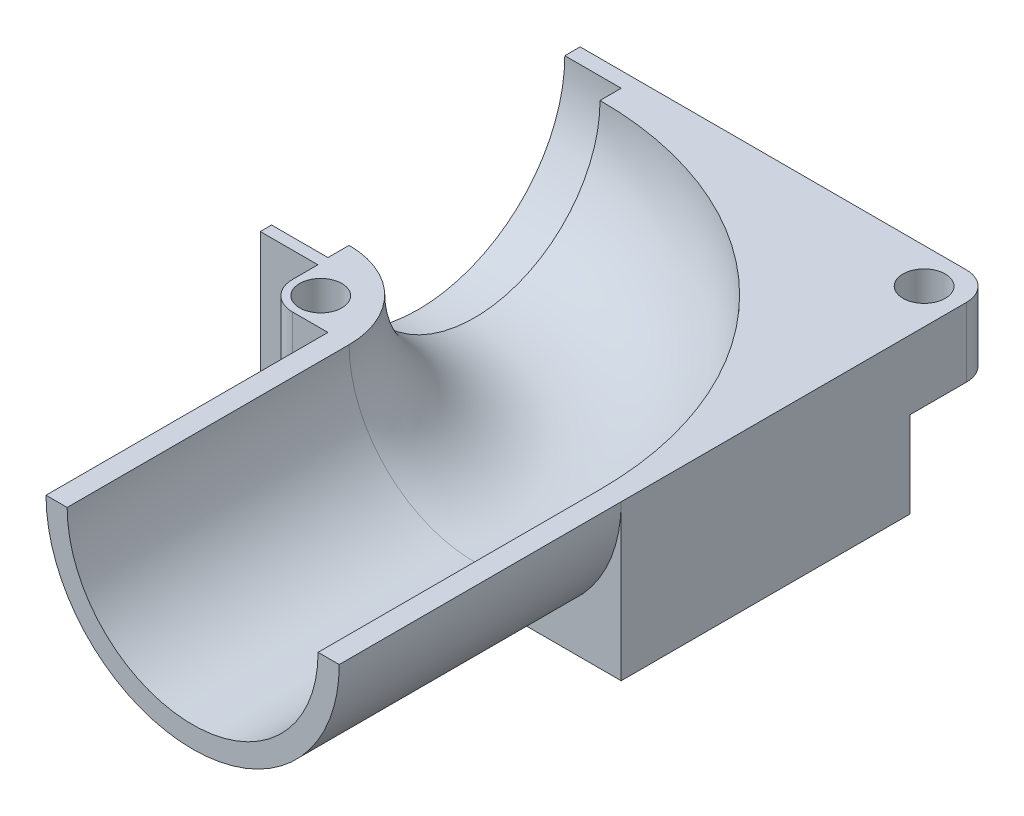
ISO-10303-21;
HEADER;
FILE_DESCRIPTION(('STEP AP214'),'2;1');
FILE_NAME('part.step','',(''),(''),'','','');
FILE_SCHEMA(('AUTOMOTIVE_DESIGN { 1 0 10303 214 1 1 1 1 }'));
ENDSEC;
DATA;
#1=APPLICATION_CONTEXT('core data for automotive mechanical design processes');
#2=APPLICATION_PROTOCOL_DEFINITION('international standard','automotive_design',2000,#1);
#3=PRODUCT_CONTEXT('',#1,'mechanical');
#4=PRODUCT('Part','Part','',(#3));
#5=PRODUCT_RELATED_PRODUCT_CATEGORY('part','',(#4));
#6=PRODUCT_DEFINITION_FORMATION('','',#4);
#7=PRODUCT_DEFINITION_CONTEXT('part definition',#1,'design');
#8=PRODUCT_DEFINITION('design','',#6,#7);
#9=PRODUCT_DEFINITION_SHAPE('','',#8);
#10=(LENGTH_UNIT() NAMED_UNIT(*) SI_UNIT(.MILLI.,.METRE.));
#11=(NAMED_UNIT(*) PLANE_ANGLE_UNIT() SI_UNIT($,.RADIAN.));
#12=(NAMED_UNIT(*) SI_UNIT($,.STERADIAN.) SOLID_ANGLE_UNIT());
#13=UNCERTAINTY_MEASURE_WITH_UNIT(LENGTH_MEASURE(1.E-05),#10,'distance_accuracy_value','');
#14=(GEOMETRIC_REPRESENTATION_CONTEXT(3) GLOBAL_UNCERTAINTY_ASSIGNED_CONTEXT((#13)) GLOBAL_UNIT_ASSIGNED_CONTEXT((#10,
#11,#12)) REPRESENTATION_CONTEXT('',''));
#15=CARTESIAN_POINT('',(0.,0.,0.));
#16=DIRECTION('',(0.,0.,1.));
#17=DIRECTION('',(1.,0.,0.));
#18=AXIS2_PLACEMENT_3D('',#15,#16,#17);
#19=CARTESIAN_POINT('',(0.,0.,0.));
#20=DIRECTION('',(0.,1.,0.));
#21=DIRECTION('',(0.,0.,1.));
#22=AXIS2_PLACEMENT_3D('',#19,#20,#21);
#23=PLANE('',#22);
#24=DIRECTION('',(0.,0.,1.));
#25=VECTOR('',#24,1.);
#26=CARTESIAN_POINT('',(23.4,0.,-11.4859338343792));
#27=LINE('',#26,#25);
#28=CARTESIAN_POINT('',(23.4,0.,-11.4859338343792));
#29=VERTEX_POINT('',#28);
#30=CARTESIAN_POINT('',(23.4,0.,-7.48593383437924));
#31=VERTEX_POINT('',#30);
#32=EDGE_CURVE('E249',#29,#31,#27,.T.);
#33=ORIENTED_EDGE('',*,*,#32,.T.);
#34=CARTESIAN_POINT('',(25.4,0.,-7.48593383437924));
#35=DIRECTION('',(0.,1.,0.));
#36=DIRECTION('',(0.,0.,1.));
#37=AXIS2_PLACEMENT_3D('',#34,#35,#36);
#38=CIRCLE('',#37,2.);
#39=CARTESIAN_POINT('',(25.4,0.,-5.48593383437924));
#40=VERTEX_POINT('',#39);
#41=EDGE_CURVE('E252',#31,#40,#38,.T.);
#42=ORIENTED_EDGE('',*,*,#41,.T.);
#43=DIRECTION('',(1.,0.,0.));
#44=VECTOR('',#43,1.);
#45=CARTESIAN_POINT('',(25.4,0.,-5.48593383437924));
#46=LINE('',#45,#44);
#47=CARTESIAN_POINT('',(29.4,0.,-5.48593383437924));
#48=VERTEX_POINT('',#47);
#49=EDGE_CURVE('E238',#40,#48,#46,.T.);
#50=ORIENTED_EDGE('',*,*,#49,.T.);
#51=DIRECTION('',(0.,0.,1.));
#52=VECTOR('',#51,1.);
#53=CARTESIAN_POINT('',(29.4,0.,-9.48593383437924));
#54=LINE('',#53,#52);
#55=CARTESIAN_POINT('',(29.4,0.,15.));
#56=VERTEX_POINT('',#55);
#57=EDGE_CURVE('E325',#48,#56,#54,.T.);
#58=ORIENTED_EDGE('',*,*,#57,.T.);
#59=DIRECTION('',(1.,0.,0.));
#60=VECTOR('',#59,1.);
#61=CARTESIAN_POINT('',(0.,0.,15.));
#62=LINE('',#61,#60);
#63=CARTESIAN_POINT('',(8.6,0.,15.));
#64=VERTEX_POINT('',#63);
#65=EDGE_CURVE('E11',#64,#56,#62,.T.);
#66=ORIENTED_EDGE('',*,*,#65,.F.);
#67=DIRECTION('',(0.,0.,-1.));
#68=VECTOR('',#67,1.);
#69=CARTESIAN_POINT('',(8.6,0.,12.7081648037772));
#70=LINE('',#69,#68);
#71=CARTESIAN_POINT('',(8.6,0.,12.7081648037772));
#72=VERTEX_POINT('',#71);
#73=EDGE_CURVE('E289',#64,#72,#70,.T.);
#74=ORIENTED_EDGE('',*,*,#73,.T.);
#75=CARTESIAN_POINT('',(6.6,0.,12.7081648037772));
#76=DIRECTION('',(0.,1.,0.));
#77=DIRECTION('',(0.,0.,-1.));
#78=AXIS2_PLACEMENT_3D('',#75,#76,#77);
#79=CIRCLE('',#78,2.);
#80=CARTESIAN_POINT('',(6.6,0.,10.7081648037772));
#81=VERTEX_POINT('',#80);
#82=EDGE_CURVE('E271',#72,#81,#79,.T.);
#83=ORIENTED_EDGE('',*,*,#82,.T.);
#84=DIRECTION('',(-1.,0.,0.));
#85=VECTOR('',#84,1.);
#86=CARTESIAN_POINT('',(4.08738612927539,0.,10.7081648037772));
#87=LINE('',#86,#85);
#88=CARTESIAN_POINT('',(4.08738612927539,0.,10.7081648037772));
#89=VERTEX_POINT('',#88);
#90=EDGE_CURVE('E266',#81,#89,#87,.T.);
#91=ORIENTED_EDGE('',*,*,#90,.T.);
#92=DIRECTION('',(0.,0.,1.));
#93=VECTOR('',#92,1.);
#94=CARTESIAN_POINT('',(4.08738612927539,0.,10.7081648037772));
#95=LINE('',#94,#93);
#96=CARTESIAN_POINT('',(4.08738612927539,0.,11.2));
#97=VERTEX_POINT('',#96);
#98=EDGE_CURVE('E286',#89,#97,#95,.T.);
#99=ORIENTED_EDGE('',*,*,#98,.T.);
#100=DIRECTION('',(-1.,0.,0.));
#101=VECTOR('',#100,1.);
#102=CARTESIAN_POINT('',(0.,0.,11.2));
#103=LINE('',#102,#101);
#104=CARTESIAN_POINT('',(0.,0.,11.2));
#105=VERTEX_POINT('',#104);
#106=EDGE_CURVE('E303',#97,#105,#103,.T.);
#107=ORIENTED_EDGE('',*,*,#106,.T.);
#108=DIRECTION('',(0.,0.,1.));
#109=VECTOR('',#108,1.);
#110=CARTESIAN_POINT('',(0.,0.,-14.4859338343792));
#111=LINE('',#110,#109);
#112=CARTESIAN_POINT('',(0.,0.,-11.4859338343792));
#113=VERTEX_POINT('',#112);
#114=EDGE_CURVE('E380',#113,#105,#111,.T.);
#115=ORIENTED_EDGE('',*,*,#114,.F.);
#116=DIRECTION('',(1.,0.,0.));
#117=VECTOR('',#116,1.);
#118=CARTESIAN_POINT('',(0.,0.,-11.4859338343792));
#119=LINE('',#118,#117);
#120=EDGE_CURVE('E329',#113,#29,#119,.T.);
#121=ORIENTED_EDGE('',*,*,#120,.T.);
#122=EDGE_LOOP('',(#33,#42,#50,#58,#66,#74,#83,#91,#99,#107,#115,#121));
#123=FACE_BOUND('',#122,.T.);
#124=ADVANCED_FACE('F37',(#123),#23,.F.);
#125=CARTESIAN_POINT('',(29.4,11.,-9.48593383437924));
#126=DIRECTION('',(1.,0.,0.));
#127=DIRECTION('',(0.,0.,-1.));
#128=AXIS2_PLACEMENT_3D('',#125,#126,#127);
#129=PLANE('',#128);
#130=ORIENTED_EDGE('',*,*,#57,.F.);
#131=DIRECTION('',(0.,-1.,0.));
#132=VECTOR('',#131,1.);
#133=CARTESIAN_POINT('',(29.4,6.1,-5.48593383437924));
#134=LINE('',#133,#132);
#135=CARTESIAN_POINT('',(29.4,6.1,-5.48593383437924));
#136=VERTEX_POINT('',#135);
#137=EDGE_CURVE('E259',#136,#48,#134,.T.);
#138=ORIENTED_EDGE('',*,*,#137,.F.);
#139=DIRECTION('',(0.,0.,-1.));
#140=VECTOR('',#139,1.);
#141=CARTESIAN_POINT('',(29.4,6.1,-5.48593383437924));
#142=LINE('',#141,#140);
#143=CARTESIAN_POINT('',(29.4,6.1,-9.48593383437924));
#144=VERTEX_POINT('',#143);
#145=EDGE_CURVE('E242',#136,#144,#142,.T.);
#146=ORIENTED_EDGE('',*,*,#145,.T.);
#147=DIRECTION('',(0.,-1.,0.));
#148=VECTOR('',#147,1.);
#149=CARTESIAN_POINT('',(29.4,11.,-9.48593383437924));
#150=LINE('',#149,#148);
#151=CARTESIAN_POINT('',(29.4,11.,-9.48593383437924));
#152=VERTEX_POINT('',#151);
#153=EDGE_CURVE('E333',#152,#144,#150,.T.);
#154=ORIENTED_EDGE('',*,*,#153,.F.);
#155=DIRECTION('',(0.,0.,1.));
#156=VECTOR('',#155,1.);
#157=CARTESIAN_POINT('',(29.4,11.,-9.48593383437924));
#158=LINE('',#157,#156);
#159=CARTESIAN_POINT('',(29.4,11.,15.));
#160=VERTEX_POINT('',#159);
#161=EDGE_CURVE('E326',#152,#160,#158,.T.);
#162=ORIENTED_EDGE('',*,*,#161,.T.);
#163=DIRECTION('',(0.,-1.,0.));
#164=VECTOR('',#163,1.);
#165=CARTESIAN_POINT('',(29.4,11.,15.));
#166=LINE('',#165,#164);
#167=EDGE_CURVE('E345',#160,#56,#166,.T.);
#168=ORIENTED_EDGE('',*,*,#167,.T.);
#169=EDGE_LOOP('',(#130,#138,#146,#154,#162,#168));
#170=FACE_BOUND('',#169,.T.);
#171=ADVANCED_FACE('F413',(#170),#129,.T.);
#172=CARTESIAN_POINT('',(0.,11.,-11.4859338343792));
#173=DIRECTION('',(0.,0.,-1.));
#174=DIRECTION('',(-1.,0.,0.));
#175=AXIS2_PLACEMENT_3D('',#172,#173,#174);
#176=PLANE('',#175);
#177=DIRECTION('',(-1.,0.,0.));
#178=VECTOR('',#177,1.);
#179=CARTESIAN_POINT('',(23.4,6.1,-11.4859338343792));
#180=LINE('',#179,#178);
#181=CARTESIAN_POINT('',(27.4,6.1,-11.4859338343792));
#182=VERTEX_POINT('',#181);
#183=CARTESIAN_POINT('',(23.4,6.1,-11.4859338343792));
#184=VERTEX_POINT('',#183);
#185=EDGE_CURVE('E54',#182,#184,#180,.T.);
#186=ORIENTED_EDGE('',*,*,#185,.T.);
#187=DIRECTION('',(0.,-1.,0.));
#188=VECTOR('',#187,1.);
#189=CARTESIAN_POINT('',(23.4,6.1,-11.4859338343792));
#190=LINE('',#189,#188);
#191=EDGE_CURVE('E248',#184,#29,#190,.T.);
#192=ORIENTED_EDGE('',*,*,#191,.T.);
#193=ORIENTED_EDGE('',*,*,#120,.F.);
#194=DIRECTION('',(0.,-1.,0.));
#195=VECTOR('',#194,1.);
#196=CARTESIAN_POINT('',(0.,11.,-11.4859338343792));
#197=LINE('',#196,#195);
#198=CARTESIAN_POINT('',(0.,11.,-11.4859338343792));
#199=VERTEX_POINT('',#198);
#200=EDGE_CURVE('E342',#199,#113,#197,.T.);
#201=ORIENTED_EDGE('',*,*,#200,.F.);
#202=DIRECTION('',(1.,0.,0.));
#203=VECTOR('',#202,1.);
#204=CARTESIAN_POINT('',(0.,11.,-11.4859338343792));
#205=LINE('',#204,#203);
#206=CARTESIAN_POINT('',(27.4,11.,-11.4859338343792));
#207=VERTEX_POINT('',#206);
#208=EDGE_CURVE('E328',#199,#207,#205,.T.);
#209=ORIENTED_EDGE('',*,*,#208,.T.);
#210=DIRECTION('',(0.,-1.,0.));
#211=VECTOR('',#210,1.);
#212=CARTESIAN_POINT('',(27.4,11.,-11.4859338343792));
#213=LINE('',#212,#211);
#214=EDGE_CURVE('E339',#207,#182,#213,.T.);
#215=ORIENTED_EDGE('',*,*,#214,.T.);
#216=EDGE_LOOP('',(#186,#192,#193,#201,#209,#215));
#217=FACE_BOUND('',#216,.T.);
#218=ADVANCED_FACE('F418',(#217),#176,.T.);
#219=CARTESIAN_POINT('',(19.,11.,15.));
#220=DIRECTION('',(0.,0.,1.));
#221=DIRECTION('',(1.,0.,0.));
#222=AXIS2_PLACEMENT_3D('',#219,#220,#221);
#223=PLANE('',#222);
#224=DIRECTION('',(1.,0.,0.));
#225=VECTOR('',#224,1.);
#226=CARTESIAN_POINT('',(8.6,6.1,15.));
#227=LINE('',#226,#225);
#228=CARTESIAN_POINT('',(6.08738612927539,6.1,15.));
#229=VERTEX_POINT('',#228);
#230=CARTESIAN_POINT('',(8.6,6.1,15.));
#231=VERTEX_POINT('',#230);
#232=EDGE_CURVE('E276',#229,#231,#227,.T.);
#233=ORIENTED_EDGE('',*,*,#232,.T.);
#234=DIRECTION('',(0.,-1.,0.));
#235=VECTOR('',#234,1.);
#236=CARTESIAN_POINT('',(8.6,6.1,15.));
#237=LINE('',#236,#235);
#238=EDGE_CURVE('E297',#231,#64,#237,.T.);
#239=ORIENTED_EDGE('',*,*,#238,.T.);
#240=ORIENTED_EDGE('',*,*,#65,.T.);
#241=ORIENTED_EDGE('',*,*,#167,.F.);
#242=CARTESIAN_POINT('',(19.,11.,15.));
#243=DIRECTION('',(0.,0.,-1.));
#244=DIRECTION('',(1.,0.,0.));
#245=AXIS2_PLACEMENT_3D('',#242,#243,#244);
#246=CIRCLE('',#245,10.4);
#247=CARTESIAN_POINT('',(8.6,11.,15.));
#248=VERTEX_POINT('',#247);
#249=EDGE_CURVE('E364',#160,#248,#246,.T.);
#250=ORIENTED_EDGE('',*,*,#249,.T.);
#251=DIRECTION('',(-1.,0.,0.));
#252=VECTOR('',#251,1.);
#253=CARTESIAN_POINT('',(-2.10907595384593,11.,15.));
#254=LINE('',#253,#252);
#255=CARTESIAN_POINT('',(6.08738612927541,11.,15.));
#256=VERTEX_POINT('',#255);
#257=EDGE_CURVE('E367',#248,#256,#254,.T.);
#258=ORIENTED_EDGE('',*,*,#257,.T.);
#259=DIRECTION('',(0.,-1.,0.));
#260=VECTOR('',#259,1.);
#261=CARTESIAN_POINT('',(6.08738612927541,11.,15.));
#262=LINE('',#261,#260);
#263=EDGE_CURVE('E322',#256,#229,#262,.T.);
#264=ORIENTED_EDGE('',*,*,#263,.T.);
#265=EDGE_LOOP('',(#233,#239,#240,#241,#250,#258,#264));
#266=FACE_BOUND('',#265,.T.);
#267=ADVANCED_FACE('F440',(#266),#223,.T.);
#268=CARTESIAN_POINT('',(6.08738612927539,11.,13.));
#269=DIRECTION('',(0.,-1.,0.));
#270=DIRECTION('',(0.,0.,-1.));
#271=AXIS2_PLACEMENT_3D('',#268,#269,#270);
#272=CYLINDRICAL_SURFACE('',#271,2.);
#273=DIRECTION('',(0.,-1.,0.));
#274=VECTOR('',#273,1.);
#275=CARTESIAN_POINT('',(4.08738612927539,11.,13.));
#276=LINE('',#275,#274);
#277=CARTESIAN_POINT('',(4.08738612927539,11.,13.));
#278=VERTEX_POINT('',#277);
#279=CARTESIAN_POINT('',(4.08738612927539,6.1,13.));
#280=VERTEX_POINT('',#279);
#281=EDGE_CURVE('E319',#278,#280,#276,.T.);
#282=ORIENTED_EDGE('',*,*,#281,.T.);
#283=CARTESIAN_POINT('',(6.08738612927539,6.1,13.));
#284=DIRECTION('',(0.,1.,0.));
#285=DIRECTION('',(0.,0.,1.));
#286=AXIS2_PLACEMENT_3D('',#283,#284,#285);
#287=CIRCLE('',#286,2.);
#288=EDGE_CURVE('E273',#280,#229,#287,.T.);
#289=ORIENTED_EDGE('',*,*,#288,.T.);
#290=ORIENTED_EDGE('',*,*,#263,.F.);
#291=CARTESIAN_POINT('',(6.08738612927539,11.,13.));
#292=DIRECTION('',(0.,-1.,0.));
#293=DIRECTION('',(0.,0.,-1.));
#294=AXIS2_PLACEMENT_3D('',#291,#292,#293);
#295=CIRCLE('',#294,2.);
#296=EDGE_CURVE('E304',#256,#278,#295,.T.);
#297=ORIENTED_EDGE('',*,*,#296,.T.);
#298=EDGE_LOOP('',(#282,#289,#290,#297));
#299=FACE_BOUND('',#298,.T.);
#300=ADVANCED_FACE('F467',(#299),#272,.T.);
#301=CARTESIAN_POINT('',(4.0873861292754,11.,11.2));
#302=DIRECTION('',(-1.,0.,0.));
#303=DIRECTION('',(0.,0.,1.));
#304=AXIS2_PLACEMENT_3D('',#301,#302,#303);
#305=PLANE('',#304);
#306=DIRECTION('',(0.,-1.,0.));
#307=VECTOR('',#306,1.);
#308=CARTESIAN_POINT('',(4.0873861292754,11.,11.2));
#309=LINE('',#308,#307);
#310=CARTESIAN_POINT('',(4.0873861292754,11.,11.2));
#311=VERTEX_POINT('',#310);
#312=CARTESIAN_POINT('',(4.0873861292754,6.1,11.2));
#313=VERTEX_POINT('',#312);
#314=EDGE_CURVE('E316',#311,#313,#309,.T.);
#315=ORIENTED_EDGE('',*,*,#314,.T.);
#316=DIRECTION('',(0.,0.,1.));
#317=VECTOR('',#316,1.);
#318=CARTESIAN_POINT('',(4.08738612927539,6.1,10.7081648037772));
#319=LINE('',#318,#317);
#320=EDGE_CURVE('E270',#313,#280,#319,.T.);
#321=ORIENTED_EDGE('',*,*,#320,.T.);
#322=ORIENTED_EDGE('',*,*,#281,.F.);
#323=DIRECTION('',(0.,0.,-1.));
#324=VECTOR('',#323,1.);
#325=CARTESIAN_POINT('',(4.0873861292754,11.,11.2));
#326=LINE('',#325,#324);
#327=EDGE_CURVE('E306',#278,#311,#326,.T.);
#328=ORIENTED_EDGE('',*,*,#327,.T.);
#329=EDGE_LOOP('',(#315,#321,#322,#328));
#330=FACE_BOUND('',#329,.T.);
#331=ADVANCED_FACE('F409',(#330),#305,.T.);
#332=CARTESIAN_POINT('',(0.,11.,-14.4859338343792));
#333=DIRECTION('',(1.,0.,0.));
#334=DIRECTION('',(0.,0.,-1.));
#335=AXIS2_PLACEMENT_3D('',#332,#333,#334);
#336=PLANE('',#335);
#337=DIRECTION('',(0.,-1.,0.));
#338=VECTOR('',#337,1.);
#339=CARTESIAN_POINT('',(0.,11.,11.2));
#340=LINE('',#339,#338);
#341=CARTESIAN_POINT('',(0.,11.,11.2));
#342=VERTEX_POINT('',#341);
#343=EDGE_CURVE('E311',#342,#105,#340,.T.);
#344=ORIENTED_EDGE('',*,*,#343,.F.);
#345=DIRECTION('',(0.,0.,1.));
#346=VECTOR('',#345,1.);
#347=CARTESIAN_POINT('',(0.,11.,-14.4859338343792));
#348=LINE('',#347,#346);
#349=CARTESIAN_POINT('',(0.,11.,10.4));
#350=VERTEX_POINT('',#349);
#351=EDGE_CURVE('E383',#350,#342,#348,.T.);
#352=ORIENTED_EDGE('',*,*,#351,.F.);
#353=CARTESIAN_POINT('',(0.,11.,0.));
#354=DIRECTION('',(1.,0.,0.));
#355=DIRECTION('',(0.,0.,1.));
#356=AXIS2_PLACEMENT_3D('',#353,#354,#355);
#357=CIRCLE('',#356,10.4);
#358=CARTESIAN_POINT('',(0.,11.,-10.4));
#359=VERTEX_POINT('',#358);
#360=EDGE_CURVE('E348',#350,#359,#357,.T.);
#361=ORIENTED_EDGE('',*,*,#360,.T.);
#362=EDGE_CURVE('E46',#199,#359,#348,.T.);
#363=ORIENTED_EDGE('',*,*,#362,.F.);
#364=ORIENTED_EDGE('',*,*,#200,.T.);
#365=ORIENTED_EDGE('',*,*,#114,.T.);
#366=EDGE_LOOP('',(#344,#352,#361,#363,#364,#365));
#367=FACE_BOUND('',#366,.T.);
#368=ADVANCED_FACE('F39',(#367),#336,.F.);
#369=CARTESIAN_POINT('',(0.,11.,0.));
#370=DIRECTION('',(0.,1.,0.));
#371=DIRECTION('',(0.,0.,1.));
#372=AXIS2_PLACEMENT_3D('',#369,#370,#371);
#373=PLANE('',#372);
#374=CARTESIAN_POINT('',(6.08738612927539,11.,13.));
#375=DIRECTION('',(0.,1.,0.));
#376=DIRECTION('',(0.,0.,1.));
#377=AXIS2_PLACEMENT_3D('',#374,#375,#376);
#378=CIRCLE('',#377,1.5);
#379=CARTESIAN_POINT('',(6.08738612927539,11.,14.5));
#380=VERTEX_POINT('',#379);
#381=EDGE_CURVE('E230',#380,#380,#378,.T.);
#382=ORIENTED_EDGE('',*,*,#381,.F.);
#383=EDGE_LOOP('',(#382));
#384=FACE_BOUND('',#383,.T.);
#385=ORIENTED_EDGE('',*,*,#327,.F.);
#386=ORIENTED_EDGE('',*,*,#296,.F.);
#387=ORIENTED_EDGE('',*,*,#257,.F.);
#388=DIRECTION('',(0.,0.,1.));
#389=VECTOR('',#388,1.);
#390=CARTESIAN_POINT('',(8.6,11.,15.));
#391=LINE('',#390,#389);
#392=CARTESIAN_POINT('',(8.6,11.,35.));
#393=VERTEX_POINT('',#392);
#394=EDGE_CURVE('E213',#248,#393,#391,.T.);
#395=ORIENTED_EDGE('',*,*,#394,.T.);
#396=DIRECTION('',(-1.,0.,0.));
#397=VECTOR('',#396,1.);
#398=CARTESIAN_POINT('',(10.1,11.,35.));
#399=LINE('',#398,#397);
#400=CARTESIAN_POINT('',(10.1,11.,35.));
#401=VERTEX_POINT('',#400);
#402=EDGE_CURVE('E209',#401,#393,#399,.T.);
#403=ORIENTED_EDGE('',*,*,#402,.F.);
#404=DIRECTION('',(0.,0.,1.));
#405=VECTOR('',#404,1.);
#406=CARTESIAN_POINT('',(10.1,11.,15.));
#407=LINE('',#406,#405);
#408=CARTESIAN_POINT('',(10.1,11.,15.));
#409=VERTEX_POINT('',#408);
#410=EDGE_CURVE('E195',#409,#401,#407,.T.);
#411=ORIENTED_EDGE('',*,*,#410,.F.);
#412=CARTESIAN_POINT('',(4.,11.,15.));
#413=DIRECTION('',(0.,-1.,0.));
#414=DIRECTION('',(0.,0.,-1.));
#415=AXIS2_PLACEMENT_3D('',#412,#413,#414);
#416=CIRCLE('',#415,6.1);
#417=CARTESIAN_POINT('',(4.,11.,8.9));
#418=VERTEX_POINT('',#417);
#419=EDGE_CURVE('E375',#418,#409,#416,.T.);
#420=ORIENTED_EDGE('',*,*,#419,.F.);
#421=DIRECTION('',(0.,0.,1.));
#422=VECTOR('',#421,1.);
#423=CARTESIAN_POINT('',(4.,11.,-10.4));
#424=LINE('',#423,#422);
#425=CARTESIAN_POINT('',(4.,11.,10.4));
#426=VERTEX_POINT('',#425);
#427=EDGE_CURVE('E352',#418,#426,#424,.T.);
#428=ORIENTED_EDGE('',*,*,#427,.T.);
#429=DIRECTION('',(-1.,0.,0.));
#430=VECTOR('',#429,1.);
#431=CARTESIAN_POINT('',(4.,11.,10.4));
#432=LINE('',#431,#430);
#433=EDGE_CURVE('E356',#426,#350,#432,.T.);
#434=ORIENTED_EDGE('',*,*,#433,.T.);
#435=ORIENTED_EDGE('',*,*,#351,.T.);
#436=DIRECTION('',(-1.,0.,0.));
#437=VECTOR('',#436,1.);
#438=CARTESIAN_POINT('',(0.,11.,11.2));
#439=LINE('',#438,#437);
#440=EDGE_CURVE('E309',#311,#342,#439,.T.);
#441=ORIENTED_EDGE('',*,*,#440,.F.);
#442=EDGE_LOOP('',(#385,#386,#387,#395,#403,#411,#420,#428,#434,#435,#441));
#443=FACE_BOUND('',#442,.T.);
#444=ADVANCED_FACE('F211',(#384,#443),#373,.T.);
#445=CARTESIAN_POINT('',(26.9,11.,-8.98593383437924));
#446=DIRECTION('',(0.,1.,0.));
#447=DIRECTION('',(0.,0.,1.));
#448=AXIS2_PLACEMENT_3D('',#445,#446,#447);
#449=CIRCLE('',#448,1.5);
#450=CARTESIAN_POINT('',(26.9,11.,-7.48593383437924));
#451=VERTEX_POINT('',#450);
#452=EDGE_CURVE('E227',#451,#451,#449,.T.);
#453=ORIENTED_EDGE('',*,*,#452,.F.);
#454=EDGE_LOOP('',(#453));
#455=FACE_BOUND('',#454,.T.);
#456=DIRECTION('',(0.,0.,1.));
#457=VECTOR('',#456,1.);
#458=CARTESIAN_POINT('',(29.4,11.,15.));
#459=LINE('',#458,#457);
#460=CARTESIAN_POINT('',(29.4,11.,35.));
#461=VERTEX_POINT('',#460);
#462=EDGE_CURVE('E370',#160,#461,#459,.T.);
#463=ORIENTED_EDGE('',*,*,#462,.F.);
#464=ORIENTED_EDGE('',*,*,#161,.F.);
#465=CARTESIAN_POINT('',(27.4,11.,-9.48593383437924));
#466=DIRECTION('',(0.,-1.,0.));
#467=DIRECTION('',(0.,0.,-1.));
#468=AXIS2_PLACEMENT_3D('',#465,#466,#467);
#469=CIRCLE('',#468,2.);
#470=EDGE_CURVE('E331',#207,#152,#469,.T.);
#471=ORIENTED_EDGE('',*,*,#470,.F.);
#472=ORIENTED_EDGE('',*,*,#208,.F.);
#473=ORIENTED_EDGE('',*,*,#362,.T.);
#474=DIRECTION('',(-1.,0.,0.));
#475=VECTOR('',#474,1.);
#476=CARTESIAN_POINT('',(4.,11.,-10.4));
#477=LINE('',#476,#475);
#478=CARTESIAN_POINT('',(4.,11.,-10.4));
#479=VERTEX_POINT('',#478);
#480=EDGE_CURVE('E361',#479,#359,#477,.T.);
#481=ORIENTED_EDGE('',*,*,#480,.F.);
#482=CARTESIAN_POINT('',(4.,11.,-8.90000000000001));
#483=VERTEX_POINT('',#482);
#484=EDGE_CURVE('E353',#479,#483,#424,.T.);
#485=ORIENTED_EDGE('',*,*,#484,.T.);
#486=CARTESIAN_POINT('',(4.,11.,15.));
#487=DIRECTION('',(0.,-1.,0.));
#488=DIRECTION('',(0.,0.,-1.));
#489=AXIS2_PLACEMENT_3D('',#486,#487,#488);
#490=CIRCLE('',#489,23.9);
#491=CARTESIAN_POINT('',(27.9,11.,15.));
#492=VERTEX_POINT('',#491);
#493=EDGE_CURVE('E206',#483,#492,#490,.T.);
#494=ORIENTED_EDGE('',*,*,#493,.T.);
#495=DIRECTION('',(0.,0.,1.));
#496=VECTOR('',#495,1.);
#497=CARTESIAN_POINT('',(27.9,11.,15.));
#498=LINE('',#497,#496);
#499=CARTESIAN_POINT('',(27.9,11.,35.));
#500=VERTEX_POINT('',#499);
#501=EDGE_CURVE('E205',#492,#500,#498,.T.);
#502=ORIENTED_EDGE('',*,*,#501,.T.);
#503=DIRECTION('',(-1.,0.,0.));
#504=VECTOR('',#503,1.);
#505=CARTESIAN_POINT('',(27.9,11.,35.));
#506=LINE('',#505,#504);
#507=EDGE_CURVE('E222',#461,#500,#506,.T.);
#508=ORIENTED_EDGE('',*,*,#507,.F.);
#509=EDGE_LOOP('',(#463,#464,#471,#472,#473,#481,#485,#494,#502,#508));
#510=FACE_BOUND('',#509,.T.);
#511=ADVANCED_FACE('F400',(#455,#510),#373,.T.);
#512=CARTESIAN_POINT('',(4.,11.,15.));
#513=DIRECTION('',(0.,-1.,0.));
#514=DIRECTION('',(0.,0.,-1.));
#515=AXIS2_PLACEMENT_3D('',#512,#513,#514);
#516=TOROIDAL_SURFACE('',#515,15.,8.9);
#517=ORIENTED_EDGE('',*,*,#493,.F.);
#518=CARTESIAN_POINT('',(4.,11.,0.));
#519=DIRECTION('',(1.,0.,0.));
#520=DIRECTION('',(0.,0.,-1.));
#521=AXIS2_PLACEMENT_3D('',#518,#519,#520);
#522=CIRCLE('',#521,8.9);
#523=EDGE_CURVE('E372',#418,#483,#522,.T.);
#524=ORIENTED_EDGE('',*,*,#523,.F.);
#525=ORIENTED_EDGE('',*,*,#419,.T.);
#526=CARTESIAN_POINT('',(19.,11.,15.));
#527=DIRECTION('',(0.,0.,1.));
#528=DIRECTION('',(1.,0.,0.));
#529=AXIS2_PLACEMENT_3D('',#526,#527,#528);
#530=CIRCLE('',#529,8.9);
#531=EDGE_CURVE('E201',#409,#492,#530,.T.);
#532=ORIENTED_EDGE('',*,*,#531,.T.);
#533=EDGE_LOOP('',(#517,#524,#525,#532));
#534=FACE_BOUND('',#533,.T.);
#535=ADVANCED_FACE('F406',(#534),#516,.F.);
#536=CARTESIAN_POINT('',(19.,11.,15.));
#537=DIRECTION('',(0.,0.,1.));
#538=DIRECTION('',(1.,0.,0.));
#539=AXIS2_PLACEMENT_3D('',#536,#537,#538);
#540=CYLINDRICAL_SURFACE('',#539,8.9);
#541=ORIENTED_EDGE('',*,*,#410,.T.);
#542=CARTESIAN_POINT('',(19.,11.,35.));
#543=DIRECTION('',(0.,0.,-1.));
#544=DIRECTION('',(1.,0.,0.));
#545=AXIS2_PLACEMENT_3D('',#542,#543,#544);
#546=CIRCLE('',#545,8.9);
#547=EDGE_CURVE('E199',#500,#401,#546,.T.);
#548=ORIENTED_EDGE('',*,*,#547,.F.);
#549=ORIENTED_EDGE('',*,*,#501,.F.);
#550=ORIENTED_EDGE('',*,*,#531,.F.);
#551=EDGE_LOOP('',(#541,#548,#549,#550));
#552=FACE_BOUND('',#551,.T.);
#553=ADVANCED_FACE('F197',(#552),#540,.F.);
#554=CARTESIAN_POINT('',(19.,11.,15.));
#555=DIRECTION('',(0.,0.,1.));
#556=DIRECTION('',(1.,0.,0.));
#557=AXIS2_PLACEMENT_3D('',#554,#555,#556);
#558=CYLINDRICAL_SURFACE('',#557,10.4);
#559=ORIENTED_EDGE('',*,*,#462,.T.);
#560=CARTESIAN_POINT('',(19.,11.,35.));
#561=DIRECTION('',(0.,0.,1.));
#562=DIRECTION('',(1.,0.,0.));
#563=AXIS2_PLACEMENT_3D('',#560,#561,#562);
#564=CIRCLE('',#563,10.4);
#565=EDGE_CURVE('E217',#393,#461,#564,.T.);
#566=ORIENTED_EDGE('',*,*,#565,.F.);
#567=ORIENTED_EDGE('',*,*,#394,.F.);
#568=ORIENTED_EDGE('',*,*,#249,.F.);
#569=EDGE_LOOP('',(#559,#566,#567,#568));
#570=FACE_BOUND('',#569,.T.);
#571=ADVANCED_FACE('F443',(#570),#558,.T.);
#572=CARTESIAN_POINT('',(4.,11.,0.));
#573=DIRECTION('',(-1.,0.,0.));
#574=DIRECTION('',(0.,0.,1.));
#575=AXIS2_PLACEMENT_3D('',#572,#573,#574);
#576=PLANE('',#575);
#577=ORIENTED_EDGE('',*,*,#523,.T.);
#578=ORIENTED_EDGE('',*,*,#484,.F.);
#579=CARTESIAN_POINT('',(4.,11.,0.));
#580=DIRECTION('',(1.,0.,0.));
#581=DIRECTION('',(0.,0.,1.));
#582=AXIS2_PLACEMENT_3D('',#579,#580,#581);
#583=CIRCLE('',#582,10.4);
#584=EDGE_CURVE('E349',#426,#479,#583,.T.);
#585=ORIENTED_EDGE('',*,*,#584,.F.);
#586=ORIENTED_EDGE('',*,*,#427,.F.);
#587=EDGE_LOOP('',(#577,#578,#585,#586));
#588=FACE_BOUND('',#587,.T.);
#589=ADVANCED_FACE('F452',(#588),#576,.T.);
#590=CARTESIAN_POINT('',(4.,11.,0.));
#591=DIRECTION('',(-1.,0.,0.));
#592=DIRECTION('',(0.,0.,1.));
#593=AXIS2_PLACEMENT_3D('',#590,#591,#592);
#594=CYLINDRICAL_SURFACE('',#593,10.4);
#595=ORIENTED_EDGE('',*,*,#360,.F.);
#596=ORIENTED_EDGE('',*,*,#433,.F.);
#597=ORIENTED_EDGE('',*,*,#584,.T.);
#598=ORIENTED_EDGE('',*,*,#480,.T.);
#599=EDGE_LOOP('',(#595,#596,#597,#598));
#600=FACE_BOUND('',#599,.T.);
#601=ADVANCED_FACE('F455',(#600),#594,.F.);
#602=CARTESIAN_POINT('',(27.4,11.,-9.48593383437924));
#603=DIRECTION('',(0.,-1.,0.));
#604=DIRECTION('',(0.,0.,-1.));
#605=AXIS2_PLACEMENT_3D('',#602,#603,#604);
#606=CYLINDRICAL_SURFACE('',#605,2.);
#607=CARTESIAN_POINT('',(27.4,6.1,-9.48593383437924));
#608=DIRECTION('',(0.,1.,0.));
#609=DIRECTION('',(0.,0.,1.));
#610=AXIS2_PLACEMENT_3D('',#607,#608,#609);
#611=CIRCLE('',#610,2.);
#612=EDGE_CURVE('E245',#144,#182,#611,.T.);
#613=ORIENTED_EDGE('',*,*,#612,.T.);
#614=ORIENTED_EDGE('',*,*,#214,.F.);
#615=ORIENTED_EDGE('',*,*,#470,.T.);
#616=ORIENTED_EDGE('',*,*,#153,.T.);
#617=EDGE_LOOP('',(#613,#614,#615,#616));
#618=FACE_BOUND('',#617,.T.);
#619=ADVANCED_FACE('F430',(#618),#606,.T.);
#620=CARTESIAN_POINT('',(0.,11.,11.2));
#621=DIRECTION('',(0.,0.,1.));
#622=DIRECTION('',(1.,0.,0.));
#623=AXIS2_PLACEMENT_3D('',#620,#621,#622);
#624=PLANE('',#623);
#625=ORIENTED_EDGE('',*,*,#106,.F.);
#626=EDGE_CURVE('E315',#313,#97,#309,.T.);
#627=ORIENTED_EDGE('',*,*,#626,.F.);
#628=ORIENTED_EDGE('',*,*,#314,.F.);
#629=ORIENTED_EDGE('',*,*,#440,.T.);
#630=ORIENTED_EDGE('',*,*,#343,.T.);
#631=EDGE_LOOP('',(#625,#627,#628,#629,#630));
#632=FACE_BOUND('',#631,.T.);
#633=ADVANCED_FACE('F461',(#632),#624,.T.);
#634=CARTESIAN_POINT('',(4.08738612927539,6.1,10.7081648037772));
#635=DIRECTION('',(0.,0.,1.));
#636=DIRECTION('',(1.,0.,0.));
#637=AXIS2_PLACEMENT_3D('',#634,#635,#636);
#638=PLANE('',#637);
#639=ORIENTED_EDGE('',*,*,#90,.F.);
#640=DIRECTION('',(0.,-1.,0.));
#641=VECTOR('',#640,1.);
#642=CARTESIAN_POINT('',(6.6,6.1,10.7081648037772));
#643=LINE('',#642,#641);
#644=CARTESIAN_POINT('',(6.6,6.1,10.7081648037772));
#645=VERTEX_POINT('',#644);
#646=EDGE_CURVE('E283',#645,#81,#643,.T.);
#647=ORIENTED_EDGE('',*,*,#646,.F.);
#648=DIRECTION('',(-1.,0.,0.));
#649=VECTOR('',#648,1.);
#650=CARTESIAN_POINT('',(4.08738612927539,6.1,10.7081648037772));
#651=LINE('',#650,#649);
#652=CARTESIAN_POINT('',(4.08738612927539,6.1,10.7081648037772));
#653=VERTEX_POINT('',#652);
#654=EDGE_CURVE('E267',#645,#653,#651,.T.);
#655=ORIENTED_EDGE('',*,*,#654,.T.);
#656=DIRECTION('',(0.,-1.,0.));
#657=VECTOR('',#656,1.);
#658=CARTESIAN_POINT('',(4.08738612927539,6.1,10.7081648037772));
#659=LINE('',#658,#657);
#660=EDGE_CURVE('E300',#653,#89,#659,.T.);
#661=ORIENTED_EDGE('',*,*,#660,.T.);
#662=EDGE_LOOP('',(#639,#647,#655,#661));
#663=FACE_BOUND('',#662,.T.);
#664=ADVANCED_FACE('F511',(#663),#638,.T.);
#665=CARTESIAN_POINT('',(4.08738612927539,6.1,10.7081648037772));
#666=DIRECTION('',(1.,0.,0.));
#667=DIRECTION('',(0.,0.,-1.));
#668=AXIS2_PLACEMENT_3D('',#665,#666,#667);
#669=PLANE('',#668);
#670=ORIENTED_EDGE('',*,*,#98,.F.);
#671=ORIENTED_EDGE('',*,*,#660,.F.);
#672=EDGE_CURVE('E62',#653,#313,#319,.T.);
#673=ORIENTED_EDGE('',*,*,#672,.T.);
#674=ORIENTED_EDGE('',*,*,#626,.T.);
#675=EDGE_LOOP('',(#670,#671,#673,#674));
#676=FACE_BOUND('',#675,.T.);
#677=ADVANCED_FACE('F508',(#676),#669,.T.);
#678=CARTESIAN_POINT('',(8.6,6.1,12.7081648037772));
#679=DIRECTION('',(-1.,0.,0.));
#680=DIRECTION('',(0.,0.,1.));
#681=AXIS2_PLACEMENT_3D('',#678,#679,#680);
#682=PLANE('',#681);
#683=ORIENTED_EDGE('',*,*,#73,.F.);
#684=ORIENTED_EDGE('',*,*,#238,.F.);
#685=DIRECTION('',(0.,0.,-1.));
#686=VECTOR('',#685,1.);
#687=CARTESIAN_POINT('',(8.6,6.1,12.7081648037772));
#688=LINE('',#687,#686);
#689=CARTESIAN_POINT('',(8.6,6.1,12.7081648037772));
#690=VERTEX_POINT('',#689);
#691=EDGE_CURVE('E279',#231,#690,#688,.T.);
#692=ORIENTED_EDGE('',*,*,#691,.T.);
#693=DIRECTION('',(0.,-1.,0.));
#694=VECTOR('',#693,1.);
#695=CARTESIAN_POINT('',(8.6,6.1,12.7081648037772));
#696=LINE('',#695,#694);
#697=EDGE_CURVE('E295',#690,#72,#696,.T.);
#698=ORIENTED_EDGE('',*,*,#697,.T.);
#699=EDGE_LOOP('',(#683,#684,#692,#698));
#700=FACE_BOUND('',#699,.T.);
#701=ADVANCED_FACE('F473',(#700),#682,.T.);
#702=CARTESIAN_POINT('',(6.6,6.1,12.7081648037772));
#703=DIRECTION('',(0.,-1.,0.));
#704=DIRECTION('',(0.,0.,-1.));
#705=AXIS2_PLACEMENT_3D('',#702,#703,#704);
#706=CYLINDRICAL_SURFACE('',#705,2.);
#707=ORIENTED_EDGE('',*,*,#82,.F.);
#708=ORIENTED_EDGE('',*,*,#697,.F.);
#709=CARTESIAN_POINT('',(6.6,6.1,12.7081648037772));
#710=DIRECTION('',(0.,1.,0.));
#711=DIRECTION('',(0.,0.,-1.));
#712=AXIS2_PLACEMENT_3D('',#709,#710,#711);
#713=CIRCLE('',#712,2.);
#714=EDGE_CURVE('E281',#690,#645,#713,.T.);
#715=ORIENTED_EDGE('',*,*,#714,.T.);
#716=ORIENTED_EDGE('',*,*,#646,.T.);
#717=EDGE_LOOP('',(#707,#708,#715,#716));
#718=FACE_BOUND('',#717,.T.);
#719=ADVANCED_FACE('F476',(#718),#706,.F.);
#720=CARTESIAN_POINT('',(6.6,6.1,12.7081648037772));
#721=DIRECTION('',(0.,-1.,0.));
#722=DIRECTION('',(0.,0.,-1.));
#723=AXIS2_PLACEMENT_3D('',#720,#721,#722);
#724=PLANE('',#723);
#725=CARTESIAN_POINT('',(6.08738612927539,6.1,13.));
#726=DIRECTION('',(0.,-1.,0.));
#727=DIRECTION('',(0.,0.,-1.));
#728=AXIS2_PLACEMENT_3D('',#725,#726,#727);
#729=CIRCLE('',#728,1.5);
#730=CARTESIAN_POINT('',(6.08738612927539,6.1,11.5));
#731=VERTEX_POINT('',#730);
#732=EDGE_CURVE('E233',#731,#731,#729,.F.);
#733=ORIENTED_EDGE('',*,*,#732,.T.);
#734=EDGE_LOOP('',(#733));
#735=FACE_BOUND('',#734,.T.);
#736=ORIENTED_EDGE('',*,*,#654,.F.);
#737=ORIENTED_EDGE('',*,*,#714,.F.);
#738=ORIENTED_EDGE('',*,*,#691,.F.);
#739=ORIENTED_EDGE('',*,*,#232,.F.);
#740=ORIENTED_EDGE('',*,*,#288,.F.);
#741=ORIENTED_EDGE('',*,*,#320,.F.);
#742=ORIENTED_EDGE('',*,*,#672,.F.);
#743=EDGE_LOOP('',(#736,#737,#738,#739,#740,#741,#742));
#744=FACE_BOUND('',#743,.T.);
#745=ADVANCED_FACE('F388',(#735,#744),#724,.T.);
#746=CARTESIAN_POINT('',(23.4,6.1,-11.4859338343792));
#747=DIRECTION('',(1.,0.,0.));
#748=DIRECTION('',(0.,0.,-1.));
#749=AXIS2_PLACEMENT_3D('',#746,#747,#748);
#750=PLANE('',#749);
#751=ORIENTED_EDGE('',*,*,#32,.F.);
#752=ORIENTED_EDGE('',*,*,#191,.F.);
#753=DIRECTION('',(0.,0.,1.));
#754=VECTOR('',#753,1.);
#755=CARTESIAN_POINT('',(23.4,6.1,-11.4859338343792));
#756=LINE('',#755,#754);
#757=CARTESIAN_POINT('',(23.4,6.1,-7.48593383437924));
#758=VERTEX_POINT('',#757);
#759=EDGE_CURVE('E234',#184,#758,#756,.T.);
#760=ORIENTED_EDGE('',*,*,#759,.T.);
#761=DIRECTION('',(0.,-1.,0.));
#762=VECTOR('',#761,1.);
#763=CARTESIAN_POINT('',(23.4,6.1,-7.48593383437924));
#764=LINE('',#763,#762);
#765=EDGE_CURVE('E263',#758,#31,#764,.T.);
#766=ORIENTED_EDGE('',*,*,#765,.T.);
#767=EDGE_LOOP('',(#751,#752,#760,#766));
#768=FACE_BOUND('',#767,.T.);
#769=ADVANCED_FACE('F423',(#768),#750,.T.);
#770=CARTESIAN_POINT('',(25.4,6.1,-7.48593383437924));
#771=DIRECTION('',(0.,-1.,0.));
#772=DIRECTION('',(0.,0.,-1.));
#773=AXIS2_PLACEMENT_3D('',#770,#771,#772);
#774=CYLINDRICAL_SURFACE('',#773,2.);
#775=ORIENTED_EDGE('',*,*,#41,.F.);
#776=ORIENTED_EDGE('',*,*,#765,.F.);
#777=CARTESIAN_POINT('',(25.4,6.1,-7.48593383437924));
#778=DIRECTION('',(0.,1.,0.));
#779=DIRECTION('',(0.,0.,1.));
#780=AXIS2_PLACEMENT_3D('',#777,#778,#779);
#781=CIRCLE('',#780,2.);
#782=CARTESIAN_POINT('',(25.4,6.1,-5.48593383437924));
#783=VERTEX_POINT('',#782);
#784=EDGE_CURVE('E237',#758,#783,#781,.T.);
#785=ORIENTED_EDGE('',*,*,#784,.T.);
#786=DIRECTION('',(0.,-1.,0.));
#787=VECTOR('',#786,1.);
#788=CARTESIAN_POINT('',(25.4,6.1,-5.48593383437924));
#789=LINE('',#788,#787);
#790=EDGE_CURVE('E261',#783,#40,#789,.T.);
#791=ORIENTED_EDGE('',*,*,#790,.T.);
#792=EDGE_LOOP('',(#775,#776,#785,#791));
#793=FACE_BOUND('',#792,.T.);
#794=ADVANCED_FACE('F492',(#793),#774,.F.);
#795=CARTESIAN_POINT('',(25.4,6.1,-5.48593383437924));
#796=DIRECTION('',(0.,0.,-1.));
#797=DIRECTION('',(-1.,0.,0.));
#798=AXIS2_PLACEMENT_3D('',#795,#796,#797);
#799=PLANE('',#798);
#800=ORIENTED_EDGE('',*,*,#49,.F.);
#801=ORIENTED_EDGE('',*,*,#790,.F.);
#802=DIRECTION('',(1.,0.,0.));
#803=VECTOR('',#802,1.);
#804=CARTESIAN_POINT('',(25.4,6.1,-5.48593383437924));
#805=LINE('',#804,#803);
#806=EDGE_CURVE('E240',#783,#136,#805,.T.);
#807=ORIENTED_EDGE('',*,*,#806,.T.);
#808=ORIENTED_EDGE('',*,*,#137,.T.);
#809=EDGE_LOOP('',(#800,#801,#807,#808));
#810=FACE_BOUND('',#809,.T.);
#811=ADVANCED_FACE('F483',(#810),#799,.T.);
#812=CARTESIAN_POINT('',(25.4,6.1,-7.48593383437924));
#813=DIRECTION('',(0.,1.,0.));
#814=DIRECTION('',(0.,0.,1.));
#815=AXIS2_PLACEMENT_3D('',#812,#813,#814);
#816=PLANE('',#815);
#817=CARTESIAN_POINT('',(26.9,6.1,-8.98593383437924));
#818=DIRECTION('',(0.,1.,0.));
#819=DIRECTION('',(0.,0.,1.));
#820=AXIS2_PLACEMENT_3D('',#817,#818,#819);
#821=CIRCLE('',#820,1.5);
#822=CARTESIAN_POINT('',(26.9,6.1,-7.48593383437924));
#823=VERTEX_POINT('',#822);
#824=EDGE_CURVE('E41',#823,#823,#821,.F.);
#825=ORIENTED_EDGE('',*,*,#824,.F.);
#826=EDGE_LOOP('',(#825));
#827=FACE_BOUND('',#826,.T.);
#828=ORIENTED_EDGE('',*,*,#759,.F.);
#829=ORIENTED_EDGE('',*,*,#185,.F.);
#830=ORIENTED_EDGE('',*,*,#612,.F.);
#831=ORIENTED_EDGE('',*,*,#145,.F.);
#832=ORIENTED_EDGE('',*,*,#806,.F.);
#833=ORIENTED_EDGE('',*,*,#784,.F.);
#834=EDGE_LOOP('',(#828,#829,#830,#831,#832,#833));
#835=FACE_BOUND('',#834,.T.);
#836=ADVANCED_FACE('F395',(#827,#835),#816,.F.);
#837=CARTESIAN_POINT('',(6.08738612927539,11.,13.));
#838=DIRECTION('',(0.,-1.,0.));
#839=DIRECTION('',(0.,0.,-1.));
#840=AXIS2_PLACEMENT_3D('',#837,#838,#839);
#841=CYLINDRICAL_SURFACE('',#840,1.5);
#842=ORIENTED_EDGE('',*,*,#732,.F.);
#843=EDGE_LOOP('',(#842));
#844=FACE_BOUND('',#843,.T.);
#845=ORIENTED_EDGE('',*,*,#381,.T.);
#846=EDGE_LOOP('',(#845));
#847=FACE_BOUND('',#846,.T.);
#848=ADVANCED_FACE('F391',(#844,#847),#841,.F.);
#849=CARTESIAN_POINT('',(26.9,11.,-8.98593383437924));
#850=DIRECTION('',(0.,-1.,0.));
#851=DIRECTION('',(0.,0.,-1.));
#852=AXIS2_PLACEMENT_3D('',#849,#850,#851);
#853=CYLINDRICAL_SURFACE('',#852,1.5);
#854=ORIENTED_EDGE('',*,*,#452,.T.);
#855=EDGE_LOOP('',(#854));
#856=FACE_BOUND('',#855,.T.);
#857=ORIENTED_EDGE('',*,*,#824,.T.);
#858=EDGE_LOOP('',(#857));
#859=FACE_BOUND('',#858,.T.);
#860=ADVANCED_FACE('F394',(#856,#859),#853,.F.);
#861=CARTESIAN_POINT('',(19.,11.,35.));
#862=DIRECTION('',(0.,0.,1.));
#863=DIRECTION('',(1.,0.,0.));
#864=AXIS2_PLACEMENT_3D('',#861,#862,#863);
#865=PLANE('',#864);
#866=ORIENTED_EDGE('',*,*,#547,.T.);
#867=ORIENTED_EDGE('',*,*,#402,.T.);
#868=ORIENTED_EDGE('',*,*,#565,.T.);
#869=ORIENTED_EDGE('',*,*,#507,.T.);
#870=EDGE_LOOP('',(#866,#867,#868,#869));
#871=FACE_BOUND('',#870,.T.);
#872=ADVANCED_FACE('F220',(#871),#865,.T.);
#873=CLOSED_SHELL('',(#124,#171,#218,#267,#300,#331,#368,#444,#511,#535,#553,#571,#589,#601,
#619,#633,#664,#677,#701,#719,#745,#769,#794,#811,#836,#848,#860,#872));
#874=MANIFOLD_SOLID_BREP('B2',#873);
#875=ADVANCED_BREP_SHAPE_REPRESENTATION('',(#18,#874),#14);
#876=SHAPE_DEFINITION_REPRESENTATION(#9,#875);
ENDSEC;
END-ISO-10303-21;
